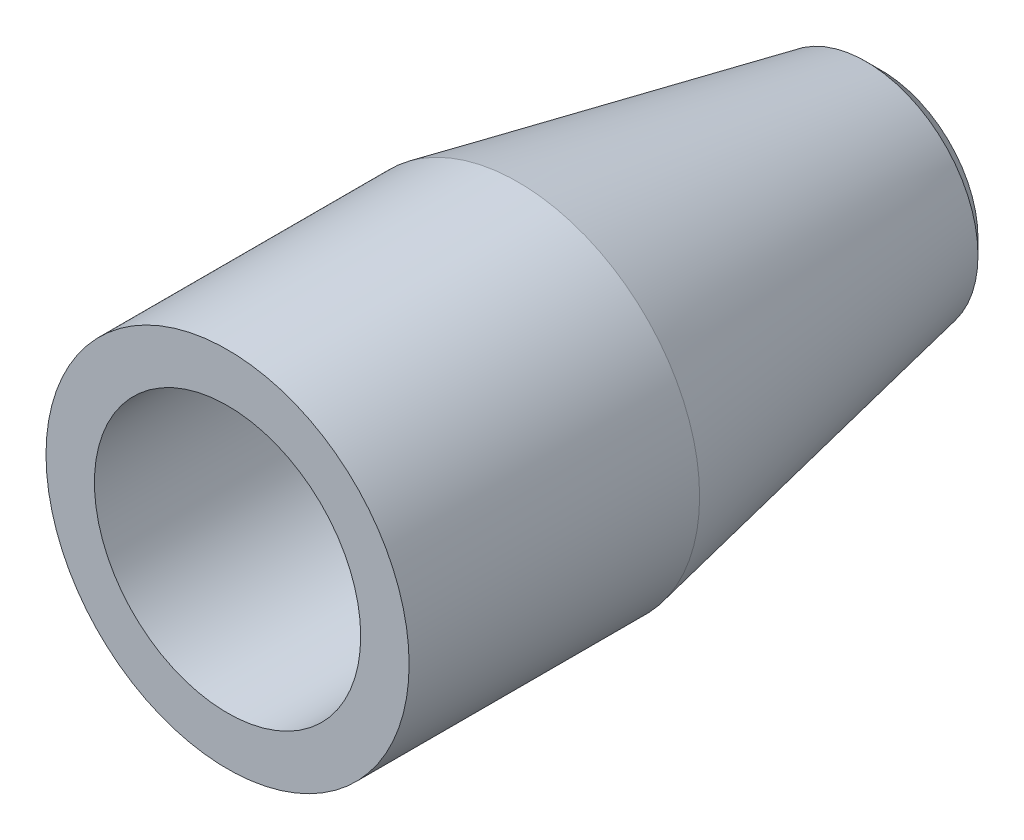
ISO-10303-21;
HEADER;
FILE_DESCRIPTION(('STEP AP214'),'2;1');
FILE_NAME('part.step','',(''),(''),'','','');
FILE_SCHEMA(('AUTOMOTIVE_DESIGN { 1 0 10303 214 1 1 1 1 }'));
ENDSEC;
DATA;
#1=APPLICATION_CONTEXT('core data for automotive mechanical design processes');
#2=APPLICATION_PROTOCOL_DEFINITION('international standard','automotive_design',2000,#1);
#3=PRODUCT_CONTEXT('',#1,'mechanical');
#4=PRODUCT('Part','Part','',(#3));
#5=PRODUCT_RELATED_PRODUCT_CATEGORY('part','',(#4));
#6=PRODUCT_DEFINITION_FORMATION('','',#4);
#7=PRODUCT_DEFINITION_CONTEXT('part definition',#1,'design');
#8=PRODUCT_DEFINITION('design','',#6,#7);
#9=PRODUCT_DEFINITION_SHAPE('','',#8);
#10=(LENGTH_UNIT() NAMED_UNIT(*) SI_UNIT(.MILLI.,.METRE.));
#11=(NAMED_UNIT(*) PLANE_ANGLE_UNIT() SI_UNIT($,.RADIAN.));
#12=(NAMED_UNIT(*) SI_UNIT($,.STERADIAN.) SOLID_ANGLE_UNIT());
#13=UNCERTAINTY_MEASURE_WITH_UNIT(LENGTH_MEASURE(1.E-05),#10,'distance_accuracy_value','');
#14=(GEOMETRIC_REPRESENTATION_CONTEXT(3) GLOBAL_UNCERTAINTY_ASSIGNED_CONTEXT((#13)) GLOBAL_UNIT_ASSIGNED_CONTEXT((#10,
#11,#12)) REPRESENTATION_CONTEXT('',''));
#15=CARTESIAN_POINT('',(0.,0.,0.));
#16=DIRECTION('',(0.,0.,1.));
#17=DIRECTION('',(1.,0.,0.));
#18=AXIS2_PLACEMENT_3D('',#15,#16,#17);
#19=CARTESIAN_POINT('',(4.5,0.,-9.23760683760684));
#20=DIRECTION('',(0.,0.,-1.));
#21=DIRECTION('',(-1.,0.,0.));
#22=AXIS2_PLACEMENT_3D('',#19,#20,#21);
#23=PLANE('',#22);
#24=CARTESIAN_POINT('',(0.,0.,-9.23760683760684));
#25=DIRECTION('',(0.,0.,-1.));
#26=DIRECTION('',(-1.,0.,0.));
#27=AXIS2_PLACEMENT_3D('',#24,#25,#26);
#28=CIRCLE('',#27,4.00000000000001);
#29=CARTESIAN_POINT('',(-4.00000000000001,0.,-9.23760683760684));
#30=VERTEX_POINT('',#29);
#31=EDGE_CURVE('E10',#30,#30,#28,.T.);
#32=ORIENTED_EDGE('',*,*,#31,.T.);
#33=EDGE_LOOP('',(#32));
#34=FACE_BOUND('',#33,.T.);
#35=CARTESIAN_POINT('',(0.,0.,-9.23760683760684));
#36=DIRECTION('',(0.,0.,1.));
#37=DIRECTION('',(1.,0.,0.));
#38=AXIS2_PLACEMENT_3D('',#35,#36,#37);
#39=CIRCLE('',#38,2.);
#40=CARTESIAN_POINT('',(2.,0.,-9.23760683760684));
#41=VERTEX_POINT('',#40);
#42=EDGE_CURVE('E60',#41,#41,#39,.T.);
#43=ORIENTED_EDGE('',*,*,#42,.T.);
#44=EDGE_LOOP('',(#43));
#45=FACE_BOUND('',#44,.T.);
#46=ADVANCED_FACE('F44',(#34,#45),#23,.T.);
#47=CARTESIAN_POINT('',(0.,0.,0.));
#48=DIRECTION('',(0.,0.,1.));
#49=DIRECTION('',(1.,0.,0.));
#50=AXIS2_PLACEMENT_3D('',#47,#48,#49);
#51=CYLINDRICAL_SURFACE('',#50,2.);
#52=CARTESIAN_POINT('',(0.,0.,-7.23760683760684));
#53=DIRECTION('',(0.,0.,1.));
#54=DIRECTION('',(1.,0.,0.));
#55=AXIS2_PLACEMENT_3D('',#52,#53,#54);
#56=CIRCLE('',#55,2.);
#57=CARTESIAN_POINT('',(2.,0.,-7.23760683760684));
#58=VERTEX_POINT('',#57);
#59=EDGE_CURVE('E64',#58,#58,#56,.T.);
#60=ORIENTED_EDGE('',*,*,#59,.T.);
#61=EDGE_LOOP('',(#60));
#62=FACE_BOUND('',#61,.T.);
#63=ORIENTED_EDGE('',*,*,#42,.F.);
#64=EDGE_LOOP('',(#63));
#65=FACE_BOUND('',#64,.T.);
#66=ADVANCED_FACE('F96',(#62,#65),#51,.F.);
#67=CARTESIAN_POINT('',(2.,0.,-7.23760683760684));
#68=DIRECTION('',(0.,0.,1.));
#69=DIRECTION('',(1.,0.,0.));
#70=AXIS2_PLACEMENT_3D('',#67,#68,#69);
#71=PLANE('',#70);
#72=CARTESIAN_POINT('',(0.,0.,-7.23760683760684));
#73=DIRECTION('',(0.,0.,1.));
#74=DIRECTION('',(1.,0.,0.));
#75=AXIS2_PLACEMENT_3D('',#72,#73,#74);
#76=CIRCLE('',#75,2.9);
#77=CARTESIAN_POINT('',(2.9,0.,-7.23760683760684));
#78=VERTEX_POINT('',#77);
#79=EDGE_CURVE('E68',#78,#78,#76,.T.);
#80=ORIENTED_EDGE('',*,*,#79,.T.);
#81=EDGE_LOOP('',(#80));
#82=FACE_BOUND('',#81,.T.);
#83=ORIENTED_EDGE('',*,*,#59,.F.);
#84=EDGE_LOOP('',(#83));
#85=FACE_BOUND('',#84,.T.);
#86=ADVANCED_FACE('F99',(#82,#85),#71,.T.);
#87=CARTESIAN_POINT('',(0.,0.,-7.23760683760684));
#88=DIRECTION('',(0.,0.,1.));
#89=DIRECTION('',(1.,0.,0.));
#90=AXIS2_PLACEMENT_3D('',#87,#88,#89);
#91=CONICAL_SURFACE('',#90,2.9,0.197395559849881);
#92=CARTESIAN_POINT('',(0.,0.,5.76239316239316));
#93=DIRECTION('',(0.,0.,1.));
#94=DIRECTION('',(1.,0.,0.));
#95=AXIS2_PLACEMENT_3D('',#92,#93,#94);
#96=CIRCLE('',#95,5.5);
#97=CARTESIAN_POINT('',(5.5,0.,5.76239316239316));
#98=VERTEX_POINT('',#97);
#99=EDGE_CURVE('E70',#98,#98,#96,.T.);
#100=ORIENTED_EDGE('',*,*,#99,.T.);
#101=EDGE_LOOP('',(#100));
#102=FACE_BOUND('',#101,.T.);
#103=ORIENTED_EDGE('',*,*,#79,.F.);
#104=EDGE_LOOP('',(#103));
#105=FACE_BOUND('',#104,.T.);
#106=ADVANCED_FACE('F110',(#102,#105),#91,.F.);
#107=CARTESIAN_POINT('',(0.,0.,0.));
#108=DIRECTION('',(0.,0.,1.));
#109=DIRECTION('',(1.,0.,0.));
#110=AXIS2_PLACEMENT_3D('',#107,#108,#109);
#111=CYLINDRICAL_SURFACE('',#110,5.5);
#112=CARTESIAN_POINT('',(0.,0.,17.7623931623932));
#113=DIRECTION('',(0.,0.,1.));
#114=DIRECTION('',(1.,0.,0.));
#115=AXIS2_PLACEMENT_3D('',#112,#113,#114);
#116=CIRCLE('',#115,5.5);
#117=CARTESIAN_POINT('',(5.5,0.,17.7623931623932));
#118=VERTEX_POINT('',#117);
#119=EDGE_CURVE('E75',#118,#118,#116,.T.);
#120=ORIENTED_EDGE('',*,*,#119,.T.);
#121=EDGE_LOOP('',(#120));
#122=FACE_BOUND('',#121,.T.);
#123=ORIENTED_EDGE('',*,*,#99,.F.);
#124=EDGE_LOOP('',(#123));
#125=FACE_BOUND('',#124,.T.);
#126=ADVANCED_FACE('F112',(#122,#125),#111,.F.);
#127=CARTESIAN_POINT('',(5.5,0.,17.7623931623932));
#128=DIRECTION('',(0.,0.,1.));
#129=DIRECTION('',(1.,0.,0.));
#130=AXIS2_PLACEMENT_3D('',#127,#128,#129);
#131=PLANE('',#130);
#132=CARTESIAN_POINT('',(0.,0.,17.7623931623932));
#133=DIRECTION('',(0.,0.,1.));
#134=DIRECTION('',(1.,0.,0.));
#135=AXIS2_PLACEMENT_3D('',#132,#133,#134);
#136=CIRCLE('',#135,7.5);
#137=CARTESIAN_POINT('',(7.5,0.,17.7623931623932));
#138=VERTEX_POINT('',#137);
#139=EDGE_CURVE('E73',#138,#138,#136,.T.);
#140=ORIENTED_EDGE('',*,*,#139,.T.);
#141=EDGE_LOOP('',(#140));
#142=FACE_BOUND('',#141,.T.);
#143=ORIENTED_EDGE('',*,*,#119,.F.);
#144=EDGE_LOOP('',(#143));
#145=FACE_BOUND('',#144,.T.);
#146=ADVANCED_FACE('F94',(#142,#145),#131,.T.);
#147=CARTESIAN_POINT('',(0.,0.,0.));
#148=DIRECTION('',(0.,0.,1.));
#149=DIRECTION('',(1.,0.,0.));
#150=AXIS2_PLACEMENT_3D('',#147,#148,#149);
#151=CYLINDRICAL_SURFACE('',#150,7.5);
#152=CARTESIAN_POINT('',(0.,0.,5.76239316239316));
#153=DIRECTION('',(0.,0.,1.));
#154=DIRECTION('',(1.,0.,0.));
#155=AXIS2_PLACEMENT_3D('',#152,#153,#154);
#156=CIRCLE('',#155,7.5);
#157=CARTESIAN_POINT('',(7.5,0.,5.76239316239316));
#158=VERTEX_POINT('',#157);
#159=EDGE_CURVE('E80',#158,#158,#156,.T.);
#160=ORIENTED_EDGE('',*,*,#159,.T.);
#161=EDGE_LOOP('',(#160));
#162=FACE_BOUND('',#161,.T.);
#163=ORIENTED_EDGE('',*,*,#139,.F.);
#164=EDGE_LOOP('',(#163));
#165=FACE_BOUND('',#164,.T.);
#166=ADVANCED_FACE('F84',(#162,#165),#151,.T.);
#167=CARTESIAN_POINT('',(0.,0.,5.76239316239316));
#168=DIRECTION('',(0.,0.,1.));
#169=DIRECTION('',(1.,0.,0.));
#170=AXIS2_PLACEMENT_3D('',#167,#168,#169);
#171=CONICAL_SURFACE('',#170,7.5,0.197395559849881);
#172=CARTESIAN_POINT('',(0.,0.,-8.61260683760684));
#173=DIRECTION('',(0.,0.,-1.));
#174=DIRECTION('',(-1.,0.,0.));
#175=AXIS2_PLACEMENT_3D('',#172,#173,#174);
#176=CIRCLE('',#175,4.625);
#177=CARTESIAN_POINT('',(-4.625,0.,-8.61260683760684));
#178=VERTEX_POINT('',#177);
#179=EDGE_CURVE('E52',#178,#178,#176,.F.);
#180=ORIENTED_EDGE('',*,*,#179,.T.);
#181=EDGE_LOOP('',(#180));
#182=FACE_BOUND('',#181,.T.);
#183=ORIENTED_EDGE('',*,*,#159,.F.);
#184=EDGE_LOOP('',(#183));
#185=FACE_BOUND('',#184,.T.);
#186=ADVANCED_FACE('F81',(#182,#185),#171,.T.);
#187=CARTESIAN_POINT('',(0.,0.,-8.61260683760685));
#188=DIRECTION('',(0.,0.,1.));
#189=DIRECTION('',(1.,0.,0.));
#190=AXIS2_PLACEMENT_3D('',#187,#188,#189);
#191=CONICAL_SURFACE('',#190,4.625,0.785398163397446);
#192=ORIENTED_EDGE('',*,*,#31,.F.);
#193=EDGE_LOOP('',(#192));
#194=FACE_BOUND('',#193,.T.);
#195=ORIENTED_EDGE('',*,*,#179,.F.);
#196=EDGE_LOOP('',(#195));
#197=FACE_BOUND('',#196,.T.);
#198=ADVANCED_FACE('F48',(#194,#197),#191,.T.);
#199=CLOSED_SHELL('',(#46,#66,#86,#106,#126,#146,#166,#186,#198));
#200=MANIFOLD_SOLID_BREP('B2',#199);
#201=ADVANCED_BREP_SHAPE_REPRESENTATION('',(#18,#200),#14);
#202=SHAPE_DEFINITION_REPRESENTATION(#9,#201);
ENDSEC;
END-ISO-10303-21;
